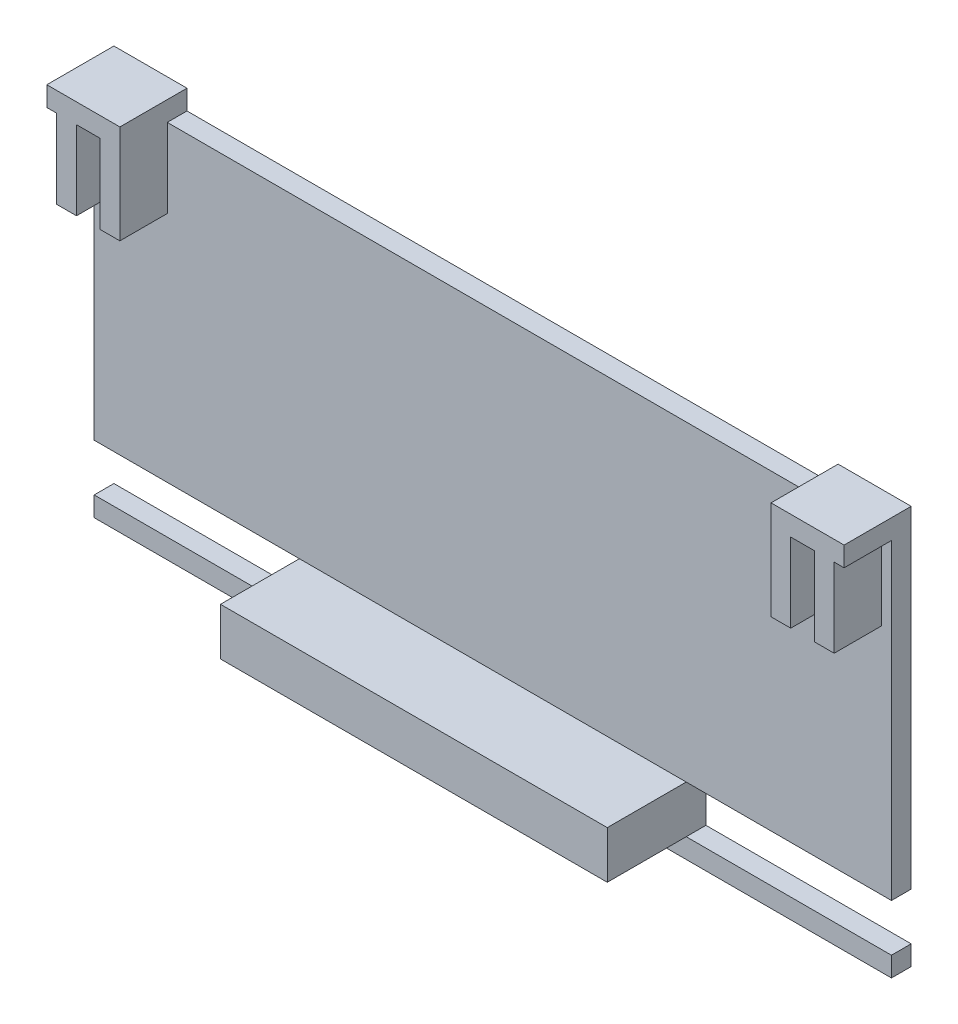
ISO-10303-21;
HEADER;
FILE_DESCRIPTION(('STEP AP214'),'2;1');
FILE_NAME('part.step','',(''),(''),'','','');
FILE_SCHEMA(('AUTOMOTIVE_DESIGN { 1 0 10303 214 1 1 1 1 }'));
ENDSEC;
DATA;
#1=APPLICATION_CONTEXT('core data for automotive mechanical design processes');
#2=APPLICATION_PROTOCOL_DEFINITION('international standard','automotive_design',2000,#1);
#3=PRODUCT_CONTEXT('',#1,'mechanical');
#4=PRODUCT('Part','Part','',(#3));
#5=PRODUCT_RELATED_PRODUCT_CATEGORY('part','',(#4));
#6=PRODUCT_DEFINITION_FORMATION('','',#4);
#7=PRODUCT_DEFINITION_CONTEXT('part definition',#1,'design');
#8=PRODUCT_DEFINITION('design','',#6,#7);
#9=PRODUCT_DEFINITION_SHAPE('','',#8);
#10=(LENGTH_UNIT() NAMED_UNIT(*) SI_UNIT(.MILLI.,.METRE.));
#11=(NAMED_UNIT(*) PLANE_ANGLE_UNIT() SI_UNIT($,.RADIAN.));
#12=(NAMED_UNIT(*) SI_UNIT($,.STERADIAN.) SOLID_ANGLE_UNIT());
#13=UNCERTAINTY_MEASURE_WITH_UNIT(LENGTH_MEASURE(1.E-05),#10,'distance_accuracy_value','');
#14=(GEOMETRIC_REPRESENTATION_CONTEXT(3) GLOBAL_UNCERTAINTY_ASSIGNED_CONTEXT((#13)) GLOBAL_UNIT_ASSIGNED_CONTEXT((#10,
#11,#12)) REPRESENTATION_CONTEXT('',''));
#15=CARTESIAN_POINT('',(0.,0.,0.));
#16=DIRECTION('',(0.,0.,1.));
#17=DIRECTION('',(1.,0.,0.));
#18=AXIS2_PLACEMENT_3D('',#15,#16,#17);
#19=CARTESIAN_POINT('',(0.,0.,1.25));
#20=DIRECTION('',(0.,0.,1.));
#21=DIRECTION('',(1.,0.,0.));
#22=AXIS2_PLACEMENT_3D('',#19,#20,#21);
#23=PLANE('',#22);
#24=DIRECTION('',(-1.,0.,0.));
#25=VECTOR('',#24,1.);
#26=CARTESIAN_POINT('',(49.25,1.25,1.25));
#27=LINE('',#26,#25);
#28=CARTESIAN_POINT('',(49.25,1.25,1.25));
#29=VERTEX_POINT('',#28);
#30=CARTESIAN_POINT('',(36.25,1.25,1.25));
#31=VERTEX_POINT('',#30);
#32=EDGE_CURVE('E362',#29,#31,#27,.T.);
#33=ORIENTED_EDGE('',*,*,#32,.T.);
#34=DIRECTION('',(1.,0.,0.));
#35=VECTOR('',#34,1.);
#36=CARTESIAN_POINT('',(11.75,1.25,1.25));
#37=LINE('',#36,#35);
#38=CARTESIAN_POINT('',(11.75,1.25,1.25));
#39=VERTEX_POINT('',#38);
#40=EDGE_CURVE('E679',#39,#31,#37,.T.);
#41=ORIENTED_EDGE('',*,*,#40,.F.);
#42=DIRECTION('',(-1.,0.,0.));
#43=VECTOR('',#42,1.);
#44=CARTESIAN_POINT('',(-1.25,1.25,1.25));
#45=LINE('',#44,#43);
#46=CARTESIAN_POINT('',(-1.25,1.25,1.25));
#47=VERTEX_POINT('',#46);
#48=EDGE_CURVE('E346',#39,#47,#45,.T.);
#49=ORIENTED_EDGE('',*,*,#48,.T.);
#50=DIRECTION('',(0.,-1.,0.));
#51=VECTOR('',#50,1.);
#52=CARTESIAN_POINT('',(-1.25,0.,1.25));
#53=LINE('',#52,#51);
#54=CARTESIAN_POINT('',(-1.25,0.,1.25));
#55=VERTEX_POINT('',#54);
#56=EDGE_CURVE('E506',#47,#55,#53,.T.);
#57=ORIENTED_EDGE('',*,*,#56,.T.);
#58=DIRECTION('',(1.,0.,0.));
#59=VECTOR('',#58,1.);
#60=CARTESIAN_POINT('',(-1.25,0.,1.25));
#61=LINE('',#60,#59);
#62=CARTESIAN_POINT('',(49.25,0.,1.25));
#63=VERTEX_POINT('',#62);
#64=EDGE_CURVE('E465',#55,#63,#61,.T.);
#65=ORIENTED_EDGE('',*,*,#64,.T.);
#66=DIRECTION('',(0.,1.,0.));
#67=VECTOR('',#66,1.);
#68=CARTESIAN_POINT('',(49.25,0.,1.25));
#69=LINE('',#68,#67);
#70=EDGE_CURVE('E494',#63,#29,#69,.T.);
#71=ORIENTED_EDGE('',*,*,#70,.T.);
#72=EDGE_LOOP('',(#33,#41,#49,#57,#65,#71));
#73=FACE_BOUND('',#72,.T.);
#74=ADVANCED_FACE('F33',(#73),#23,.T.);
#75=DIRECTION('',(1.,0.,0.));
#76=VECTOR('',#75,1.);
#77=CARTESIAN_POINT('',(-1.25,4.25,1.25));
#78=LINE('',#77,#76);
#79=CARTESIAN_POINT('',(-1.25,4.25,1.25));
#80=VERTEX_POINT('',#79);
#81=CARTESIAN_POINT('',(11.75,4.25,1.25));
#82=VERTEX_POINT('',#81);
#83=EDGE_CURVE('E350',#80,#82,#78,.T.);
#84=ORIENTED_EDGE('',*,*,#83,.T.);
#85=DIRECTION('',(-1.,0.,0.));
#86=VECTOR('',#85,1.);
#87=CARTESIAN_POINT('',(11.75,4.25,1.25));
#88=LINE('',#87,#86);
#89=CARTESIAN_POINT('',(36.25,4.25,1.25));
#90=VERTEX_POINT('',#89);
#91=EDGE_CURVE('E274',#90,#82,#88,.T.);
#92=ORIENTED_EDGE('',*,*,#91,.F.);
#93=DIRECTION('',(1.,0.,0.));
#94=VECTOR('',#93,1.);
#95=CARTESIAN_POINT('',(49.25,4.25,1.25));
#96=LINE('',#95,#94);
#97=CARTESIAN_POINT('',(49.25,4.25,1.25));
#98=VERTEX_POINT('',#97);
#99=EDGE_CURVE('E370',#90,#98,#96,.T.);
#100=ORIENTED_EDGE('',*,*,#99,.T.);
#101=CARTESIAN_POINT('',(49.25,24.,1.25));
#102=VERTEX_POINT('',#101);
#103=EDGE_CURVE('E528',#98,#102,#69,.T.);
#104=ORIENTED_EDGE('',*,*,#103,.T.);
#105=DIRECTION('',(-1.,0.,0.));
#106=VECTOR('',#105,1.);
#107=CARTESIAN_POINT('',(-1.25,24.,1.25));
#108=LINE('',#107,#106);
#109=CARTESIAN_POINT('',(48.6214635015819,24.,1.25));
#110=VERTEX_POINT('',#109);
#111=EDGE_CURVE('E504',#102,#110,#108,.T.);
#112=ORIENTED_EDGE('',*,*,#111,.T.);
#113=DIRECTION('',(0.,1.,0.));
#114=VECTOR('',#113,1.);
#115=CARTESIAN_POINT('',(48.6214635015819,19.,1.25));
#116=LINE('',#115,#114);
#117=CARTESIAN_POINT('',(48.6214635015819,19.,1.25));
#118=VERTEX_POINT('',#117);
#119=EDGE_CURVE('E473',#118,#110,#116,.T.);
#120=ORIENTED_EDGE('',*,*,#119,.F.);
#121=DIRECTION('',(-1.,0.,0.));
#122=VECTOR('',#121,1.);
#123=CARTESIAN_POINT('',(47.3714635015819,19.,1.25));
#124=LINE('',#123,#122);
#125=CARTESIAN_POINT('',(47.3714635015819,19.,1.25));
#126=VERTEX_POINT('',#125);
#127=EDGE_CURVE('E459',#118,#126,#124,.T.);
#128=ORIENTED_EDGE('',*,*,#127,.T.);
#129=DIRECTION('',(0.,1.,0.));
#130=VECTOR('',#129,1.);
#131=CARTESIAN_POINT('',(47.3714635015819,19.,1.25));
#132=LINE('',#131,#130);
#133=CARTESIAN_POINT('',(47.3714635015819,24.,1.25));
#134=VERTEX_POINT('',#133);
#135=EDGE_CURVE('E468',#126,#134,#132,.T.);
#136=ORIENTED_EDGE('',*,*,#135,.T.);
#137=CARTESIAN_POINT('',(45.8714635015819,24.,1.25));
#138=VERTEX_POINT('',#137);
#139=EDGE_CURVE('E489',#134,#138,#108,.T.);
#140=ORIENTED_EDGE('',*,*,#139,.T.);
#141=DIRECTION('',(0.,1.,0.));
#142=VECTOR('',#141,1.);
#143=CARTESIAN_POINT('',(45.8714635015819,19.,1.25));
#144=LINE('',#143,#142);
#145=CARTESIAN_POINT('',(45.8714635015819,19.,1.25));
#146=VERTEX_POINT('',#145);
#147=EDGE_CURVE('E443',#146,#138,#144,.T.);
#148=ORIENTED_EDGE('',*,*,#147,.F.);
#149=DIRECTION('',(-1.,0.,0.));
#150=VECTOR('',#149,1.);
#151=CARTESIAN_POINT('',(45.8714635015819,19.,1.25));
#152=LINE('',#151,#150);
#153=CARTESIAN_POINT('',(44.6214635015819,19.,1.25));
#154=VERTEX_POINT('',#153);
#155=EDGE_CURVE('E435',#146,#154,#152,.T.);
#156=ORIENTED_EDGE('',*,*,#155,.T.);
#157=DIRECTION('',(0.,1.,0.));
#158=VECTOR('',#157,1.);
#159=CARTESIAN_POINT('',(44.6214635015819,19.,1.25));
#160=LINE('',#159,#158);
#161=CARTESIAN_POINT('',(44.6214635015819,24.,1.25));
#162=VERTEX_POINT('',#161);
#163=EDGE_CURVE('E447',#154,#162,#160,.T.);
#164=ORIENTED_EDGE('',*,*,#163,.T.);
#165=CARTESIAN_POINT('',(3.37853649841815,24.,1.25));
#166=VERTEX_POINT('',#165);
#167=EDGE_CURVE('E485',#162,#166,#108,.T.);
#168=ORIENTED_EDGE('',*,*,#167,.T.);
#169=DIRECTION('',(0.,1.,0.));
#170=VECTOR('',#169,1.);
#171=CARTESIAN_POINT('',(3.37853649841815,19.,1.25));
#172=LINE('',#171,#170);
#173=CARTESIAN_POINT('',(3.37853649841815,19.,1.25));
#174=VERTEX_POINT('',#173);
#175=EDGE_CURVE('E423',#174,#166,#172,.T.);
#176=ORIENTED_EDGE('',*,*,#175,.F.);
#177=DIRECTION('',(-1.,0.,0.));
#178=VECTOR('',#177,1.);
#179=CARTESIAN_POINT('',(2.12853649841815,19.,1.25));
#180=LINE('',#179,#178);
#181=CARTESIAN_POINT('',(2.12853649841815,19.,1.25));
#182=VERTEX_POINT('',#181);
#183=EDGE_CURVE('E409',#174,#182,#180,.T.);
#184=ORIENTED_EDGE('',*,*,#183,.T.);
#185=DIRECTION('',(0.,1.,0.));
#186=VECTOR('',#185,1.);
#187=CARTESIAN_POINT('',(2.12853649841815,19.,1.25));
#188=LINE('',#187,#186);
#189=CARTESIAN_POINT('',(2.12853649841815,24.,1.25));
#190=VERTEX_POINT('',#189);
#191=EDGE_CURVE('E420',#182,#190,#188,.T.);
#192=ORIENTED_EDGE('',*,*,#191,.T.);
#193=CARTESIAN_POINT('',(0.628536498418146,24.,1.25));
#194=VERTEX_POINT('',#193);
#195=EDGE_CURVE('E490',#190,#194,#108,.T.);
#196=ORIENTED_EDGE('',*,*,#195,.T.);
#197=DIRECTION('',(0.,1.,0.));
#198=VECTOR('',#197,1.);
#199=CARTESIAN_POINT('',(0.628536498418146,19.,1.25));
#200=LINE('',#199,#198);
#201=CARTESIAN_POINT('',(0.628536498418146,19.,1.25));
#202=VERTEX_POINT('',#201);
#203=EDGE_CURVE('E400',#202,#194,#200,.T.);
#204=ORIENTED_EDGE('',*,*,#203,.F.);
#205=DIRECTION('',(-1.,0.,0.));
#206=VECTOR('',#205,1.);
#207=CARTESIAN_POINT('',(0.628536498418146,19.,1.25));
#208=LINE('',#207,#206);
#209=CARTESIAN_POINT('',(-0.621463501581855,19.,1.25));
#210=VERTEX_POINT('',#209);
#211=EDGE_CURVE('E383',#202,#210,#208,.T.);
#212=ORIENTED_EDGE('',*,*,#211,.T.);
#213=DIRECTION('',(0.,1.,0.));
#214=VECTOR('',#213,1.);
#215=CARTESIAN_POINT('',(-0.621463501581855,19.,1.25));
#216=LINE('',#215,#214);
#217=CARTESIAN_POINT('',(-0.621463501581855,24.,1.25));
#218=VERTEX_POINT('',#217);
#219=EDGE_CURVE('E395',#210,#218,#216,.T.);
#220=ORIENTED_EDGE('',*,*,#219,.T.);
#221=CARTESIAN_POINT('',(-1.25,24.,1.25));
#222=VERTEX_POINT('',#221);
#223=EDGE_CURVE('E519',#218,#222,#108,.T.);
#224=ORIENTED_EDGE('',*,*,#223,.T.);
#225=EDGE_CURVE('E496',#222,#80,#53,.T.);
#226=ORIENTED_EDGE('',*,*,#225,.T.);
#227=EDGE_LOOP('',(#84,#92,#100,#104,#112,#120,#128,#136,#140,#148,#156,#164,#168,#176,#184,
#192,#196,#204,#212,#220,#224,#226));
#228=FACE_BOUND('',#227,.T.);
#229=ADVANCED_FACE('F550',(#228),#23,.T.);
#230=CARTESIAN_POINT('',(-1.25,24.,1.25));
#231=DIRECTION('',(0.,-1.,0.));
#232=DIRECTION('',(0.,0.,-1.));
#233=AXIS2_PLACEMENT_3D('',#230,#231,#232);
#234=PLANE('',#233);
#235=DIRECTION('',(0.,0.,-1.));
#236=VECTOR('',#235,1.);
#237=CARTESIAN_POINT('',(3.37853649841815,24.,4.25));
#238=LINE('',#237,#236);
#239=CARTESIAN_POINT('',(3.37853649841815,24.,0.));
#240=VERTEX_POINT('',#239);
#241=EDGE_CURVE('E280',#166,#240,#238,.T.);
#242=ORIENTED_EDGE('',*,*,#241,.F.);
#243=ORIENTED_EDGE('',*,*,#167,.F.);
#244=DIRECTION('',(0.,0.,1.));
#245=VECTOR('',#244,1.);
#246=CARTESIAN_POINT('',(44.6214635015819,24.,4.25));
#247=LINE('',#246,#245);
#248=CARTESIAN_POINT('',(44.6214635015819,24.,0.));
#249=VERTEX_POINT('',#248);
#250=EDGE_CURVE('E55',#249,#162,#247,.T.);
#251=ORIENTED_EDGE('',*,*,#250,.F.);
#252=DIRECTION('',(-1.,0.,0.));
#253=VECTOR('',#252,1.);
#254=CARTESIAN_POINT('',(-1.25,24.,0.));
#255=LINE('',#254,#253);
#256=EDGE_CURVE('E50',#249,#240,#255,.T.);
#257=ORIENTED_EDGE('',*,*,#256,.T.);
#258=EDGE_LOOP('',(#242,#243,#251,#257));
#259=FACE_BOUND('',#258,.T.);
#260=ADVANCED_FACE('F705',(#259),#234,.F.);
#261=CARTESIAN_POINT('',(-1.25,0.,1.25));
#262=DIRECTION('',(1.,0.,0.));
#263=DIRECTION('',(0.,0.,-1.));
#264=AXIS2_PLACEMENT_3D('',#261,#262,#263);
#265=PLANE('',#264);
#266=DIRECTION('',(0.,-1.,0.));
#267=VECTOR('',#266,1.);
#268=CARTESIAN_POINT('',(-1.25,0.,0.));
#269=LINE('',#268,#267);
#270=CARTESIAN_POINT('',(-1.25,25.25,0.));
#271=VERTEX_POINT('',#270);
#272=CARTESIAN_POINT('',(-1.25,4.25,0.));
#273=VERTEX_POINT('',#272);
#274=EDGE_CURVE('E510',#271,#273,#269,.T.);
#275=ORIENTED_EDGE('',*,*,#274,.T.);
#276=DIRECTION('',(0.,0.,-1.));
#277=VECTOR('',#276,1.);
#278=CARTESIAN_POINT('',(-1.25,4.25,14.5916640641263));
#279=LINE('',#278,#277);
#280=EDGE_CURVE('E340',#80,#273,#279,.T.);
#281=ORIENTED_EDGE('',*,*,#280,.F.);
#282=ORIENTED_EDGE('',*,*,#225,.F.);
#283=DIRECTION('',(0.,0.,1.));
#284=VECTOR('',#283,1.);
#285=CARTESIAN_POINT('',(-1.25,24.,4.25));
#286=LINE('',#285,#284);
#287=CARTESIAN_POINT('',(-1.25,24.,4.25));
#288=VERTEX_POINT('',#287);
#289=EDGE_CURVE('E282',#222,#288,#286,.T.);
#290=ORIENTED_EDGE('',*,*,#289,.T.);
#291=DIRECTION('',(0.,-1.,0.));
#292=VECTOR('',#291,1.);
#293=CARTESIAN_POINT('',(-1.25,25.25,4.25));
#294=LINE('',#293,#292);
#295=CARTESIAN_POINT('',(-1.25,25.25,4.25));
#296=VERTEX_POINT('',#295);
#297=EDGE_CURVE('E299',#296,#288,#294,.T.);
#298=ORIENTED_EDGE('',*,*,#297,.F.);
#299=DIRECTION('',(0.,0.,1.));
#300=VECTOR('',#299,1.);
#301=CARTESIAN_POINT('',(-1.25,25.25,4.25));
#302=LINE('',#301,#300);
#303=EDGE_CURVE('E295',#271,#296,#302,.T.);
#304=ORIENTED_EDGE('',*,*,#303,.F.);
#305=EDGE_LOOP('',(#275,#281,#282,#290,#298,#304));
#306=FACE_BOUND('',#305,.T.);
#307=ADVANCED_FACE('F666',(#306),#265,.F.);
#308=CARTESIAN_POINT('',(49.25,0.,1.25));
#309=DIRECTION('',(-1.,0.,0.));
#310=DIRECTION('',(0.,0.,1.));
#311=AXIS2_PLACEMENT_3D('',#308,#309,#310);
#312=PLANE('',#311);
#313=DIRECTION('',(0.,1.,0.));
#314=VECTOR('',#313,1.);
#315=CARTESIAN_POINT('',(49.25,0.,0.));
#316=LINE('',#315,#314);
#317=CARTESIAN_POINT('',(49.25,0.,0.));
#318=VERTEX_POINT('',#317);
#319=CARTESIAN_POINT('',(49.25,1.25,0.));
#320=VERTEX_POINT('',#319);
#321=EDGE_CURVE('E516',#318,#320,#316,.T.);
#322=ORIENTED_EDGE('',*,*,#321,.T.);
#323=DIRECTION('',(0.,0.,-1.));
#324=VECTOR('',#323,1.);
#325=CARTESIAN_POINT('',(49.25,1.25,14.5916640641263));
#326=LINE('',#325,#324);
#327=EDGE_CURVE('E377',#29,#320,#326,.T.);
#328=ORIENTED_EDGE('',*,*,#327,.F.);
#329=ORIENTED_EDGE('',*,*,#70,.F.);
#330=DIRECTION('',(0.,0.,-1.));
#331=VECTOR('',#330,1.);
#332=CARTESIAN_POINT('',(49.25,0.,1.25));
#333=LINE('',#332,#331);
#334=EDGE_CURVE('E11',#63,#318,#333,.T.);
#335=ORIENTED_EDGE('',*,*,#334,.T.);
#336=EDGE_LOOP('',(#322,#328,#329,#335));
#337=FACE_BOUND('',#336,.T.);
#338=ADVANCED_FACE('F592',(#337),#312,.F.);
#339=CARTESIAN_POINT('',(-1.25,0.,1.25));
#340=DIRECTION('',(0.,1.,0.));
#341=DIRECTION('',(-1.,0.,0.));
#342=AXIS2_PLACEMENT_3D('',#339,#340,#341);
#343=PLANE('',#342);
#344=DIRECTION('',(1.,0.,0.));
#345=VECTOR('',#344,1.);
#346=CARTESIAN_POINT('',(-1.25,0.,0.));
#347=LINE('',#346,#345);
#348=CARTESIAN_POINT('',(-1.25,0.,0.));
#349=VERTEX_POINT('',#348);
#350=EDGE_CURVE('E472',#349,#318,#347,.T.);
#351=ORIENTED_EDGE('',*,*,#350,.T.);
#352=ORIENTED_EDGE('',*,*,#334,.F.);
#353=ORIENTED_EDGE('',*,*,#64,.F.);
#354=DIRECTION('',(0.,0.,-1.));
#355=VECTOR('',#354,1.);
#356=CARTESIAN_POINT('',(-1.25,0.,1.25));
#357=LINE('',#356,#355);
#358=EDGE_CURVE('E42',#55,#349,#357,.T.);
#359=ORIENTED_EDGE('',*,*,#358,.T.);
#360=EDGE_LOOP('',(#351,#352,#353,#359));
#361=FACE_BOUND('',#360,.T.);
#362=ADVANCED_FACE('F35',(#361),#343,.F.);
#363=ORIENTED_EDGE('',*,*,#103,.F.);
#364=DIRECTION('',(0.,0.,-1.));
#365=VECTOR('',#364,1.);
#366=CARTESIAN_POINT('',(49.25,4.25,14.5916640641263));
#367=LINE('',#366,#365);
#368=CARTESIAN_POINT('',(49.25,4.25,0.));
#369=VERTEX_POINT('',#368);
#370=EDGE_CURVE('E373',#98,#369,#367,.T.);
#371=ORIENTED_EDGE('',*,*,#370,.T.);
#372=CARTESIAN_POINT('',(49.25,25.25,0.));
#373=VERTEX_POINT('',#372);
#374=EDGE_CURVE('E674',#369,#373,#316,.T.);
#375=ORIENTED_EDGE('',*,*,#374,.T.);
#376=DIRECTION('',(0.,0.,-1.));
#377=VECTOR('',#376,1.);
#378=CARTESIAN_POINT('',(49.25,25.25,4.25));
#379=LINE('',#378,#377);
#380=CARTESIAN_POINT('',(49.25,25.25,4.25));
#381=VERTEX_POINT('',#380);
#382=EDGE_CURVE('E316',#381,#373,#379,.T.);
#383=ORIENTED_EDGE('',*,*,#382,.F.);
#384=DIRECTION('',(0.,-1.,0.));
#385=VECTOR('',#384,1.);
#386=CARTESIAN_POINT('',(49.25,25.25,4.25));
#387=LINE('',#386,#385);
#388=CARTESIAN_POINT('',(49.25,24.,4.25));
#389=VERTEX_POINT('',#388);
#390=EDGE_CURVE('E330',#381,#389,#387,.T.);
#391=ORIENTED_EDGE('',*,*,#390,.T.);
#392=DIRECTION('',(0.,0.,-1.));
#393=VECTOR('',#392,1.);
#394=CARTESIAN_POINT('',(49.25,24.,4.25));
#395=LINE('',#394,#393);
#396=EDGE_CURVE('E314',#389,#102,#395,.T.);
#397=ORIENTED_EDGE('',*,*,#396,.T.);
#398=EDGE_LOOP('',(#363,#371,#375,#383,#391,#397));
#399=FACE_BOUND('',#398,.T.);
#400=ADVANCED_FACE('F616',(#399),#312,.F.);
#401=ORIENTED_EDGE('',*,*,#56,.F.);
#402=DIRECTION('',(0.,0.,-1.));
#403=VECTOR('',#402,1.);
#404=CARTESIAN_POINT('',(-1.25,1.25,14.5916640641263));
#405=LINE('',#404,#403);
#406=CARTESIAN_POINT('',(-1.25,1.25,0.));
#407=VERTEX_POINT('',#406);
#408=EDGE_CURVE('E349',#47,#407,#405,.T.);
#409=ORIENTED_EDGE('',*,*,#408,.T.);
#410=EDGE_CURVE('E513',#407,#349,#269,.T.);
#411=ORIENTED_EDGE('',*,*,#410,.T.);
#412=ORIENTED_EDGE('',*,*,#358,.F.);
#413=EDGE_LOOP('',(#401,#409,#411,#412));
#414=FACE_BOUND('',#413,.T.);
#415=ADVANCED_FACE('F671',(#414),#265,.F.);
#416=CARTESIAN_POINT('',(0.,0.,0.));
#417=DIRECTION('',(0.,0.,1.));
#418=DIRECTION('',(1.,0.,0.));
#419=AXIS2_PLACEMENT_3D('',#416,#417,#418);
#420=PLANE('',#419);
#421=DIRECTION('',(0.,-1.,0.));
#422=VECTOR('',#421,1.);
#423=CARTESIAN_POINT('',(11.75,1.25,0.));
#424=LINE('',#423,#422);
#425=CARTESIAN_POINT('',(11.75,4.25,0.));
#426=VERTEX_POINT('',#425);
#427=CARTESIAN_POINT('',(11.75,1.25,0.));
#428=VERTEX_POINT('',#427);
#429=EDGE_CURVE('E338',#426,#428,#424,.T.);
#430=ORIENTED_EDGE('',*,*,#429,.F.);
#431=DIRECTION('',(1.,0.,0.));
#432=VECTOR('',#431,1.);
#433=CARTESIAN_POINT('',(-1.25,4.25,0.));
#434=LINE('',#433,#432);
#435=EDGE_CURVE('E341',#273,#426,#434,.T.);
#436=ORIENTED_EDGE('',*,*,#435,.F.);
#437=ORIENTED_EDGE('',*,*,#274,.F.);
#438=DIRECTION('',(-1.,0.,0.));
#439=VECTOR('',#438,1.);
#440=CARTESIAN_POINT('',(3.37853649841815,25.25,0.));
#441=LINE('',#440,#439);
#442=CARTESIAN_POINT('',(3.37853649841815,25.25,0.));
#443=VERTEX_POINT('',#442);
#444=EDGE_CURVE('E291',#443,#271,#441,.T.);
#445=ORIENTED_EDGE('',*,*,#444,.F.);
#446=DIRECTION('',(0.,-1.,0.));
#447=VECTOR('',#446,1.);
#448=CARTESIAN_POINT('',(3.37853649841815,25.25,0.));
#449=LINE('',#448,#447);
#450=EDGE_CURVE('E307',#443,#240,#449,.T.);
#451=ORIENTED_EDGE('',*,*,#450,.T.);
#452=ORIENTED_EDGE('',*,*,#256,.F.);
#453=DIRECTION('',(0.,-1.,0.));
#454=VECTOR('',#453,1.);
#455=CARTESIAN_POINT('',(44.6214635015819,25.25,0.));
#456=LINE('',#455,#454);
#457=CARTESIAN_POINT('',(44.6214635015819,25.25,0.));
#458=VERTEX_POINT('',#457);
#459=EDGE_CURVE('E321',#458,#249,#456,.T.);
#460=ORIENTED_EDGE('',*,*,#459,.F.);
#461=DIRECTION('',(-1.,0.,0.));
#462=VECTOR('',#461,1.);
#463=CARTESIAN_POINT('',(44.6214635015819,25.25,0.));
#464=LINE('',#463,#462);
#465=EDGE_CURVE('E319',#373,#458,#464,.T.);
#466=ORIENTED_EDGE('',*,*,#465,.F.);
#467=ORIENTED_EDGE('',*,*,#374,.F.);
#468=DIRECTION('',(1.,0.,0.));
#469=VECTOR('',#468,1.);
#470=CARTESIAN_POINT('',(49.25,4.25,0.));
#471=LINE('',#470,#469);
#472=CARTESIAN_POINT('',(36.25,4.25,0.));
#473=VERTEX_POINT('',#472);
#474=EDGE_CURVE('E360',#473,#369,#471,.T.);
#475=ORIENTED_EDGE('',*,*,#474,.F.);
#476=DIRECTION('',(0.,1.,0.));
#477=VECTOR('',#476,1.);
#478=CARTESIAN_POINT('',(36.25,1.25,0.));
#479=LINE('',#478,#477);
#480=CARTESIAN_POINT('',(36.25,1.25,0.));
#481=VERTEX_POINT('',#480);
#482=EDGE_CURVE('E363',#481,#473,#479,.T.);
#483=ORIENTED_EDGE('',*,*,#482,.F.);
#484=DIRECTION('',(-1.,0.,0.));
#485=VECTOR('',#484,1.);
#486=CARTESIAN_POINT('',(49.25,1.25,0.));
#487=LINE('',#486,#485);
#488=EDGE_CURVE('E359',#320,#481,#487,.T.);
#489=ORIENTED_EDGE('',*,*,#488,.F.);
#490=ORIENTED_EDGE('',*,*,#321,.F.);
#491=ORIENTED_EDGE('',*,*,#350,.F.);
#492=ORIENTED_EDGE('',*,*,#410,.F.);
#493=DIRECTION('',(-1.,0.,0.));
#494=VECTOR('',#493,1.);
#495=CARTESIAN_POINT('',(-1.25,1.25,0.));
#496=LINE('',#495,#494);
#497=EDGE_CURVE('E344',#428,#407,#496,.T.);
#498=ORIENTED_EDGE('',*,*,#497,.F.);
#499=EDGE_LOOP('',(#430,#436,#437,#445,#451,#452,#460,#466,#467,#475,#483,#489,#490,#491,#492,#498));
#500=FACE_BOUND('',#499,.T.);
#501=ADVANCED_FACE('F600',(#500),#420,.F.);
#502=CARTESIAN_POINT('',(47.3714635015819,19.,1.25));
#503=DIRECTION('',(-1.,0.,0.));
#504=DIRECTION('',(0.,-1.,0.));
#505=AXIS2_PLACEMENT_3D('',#502,#503,#504);
#506=PLANE('',#505);
#507=DIRECTION('',(0.,0.,1.));
#508=VECTOR('',#507,1.);
#509=CARTESIAN_POINT('',(47.3714635015819,24.,1.25));
#510=LINE('',#509,#508);
#511=CARTESIAN_POINT('',(47.3714635015819,24.,4.25));
#512=VERTEX_POINT('',#511);
#513=EDGE_CURVE('E482',#134,#512,#510,.T.);
#514=ORIENTED_EDGE('',*,*,#513,.F.);
#515=ORIENTED_EDGE('',*,*,#135,.F.);
#516=DIRECTION('',(0.,0.,1.));
#517=VECTOR('',#516,1.);
#518=CARTESIAN_POINT('',(47.3714635015819,19.,1.25));
#519=LINE('',#518,#517);
#520=CARTESIAN_POINT('',(47.3714635015819,19.,4.25));
#521=VERTEX_POINT('',#520);
#522=EDGE_CURVE('E450',#126,#521,#519,.T.);
#523=ORIENTED_EDGE('',*,*,#522,.T.);
#524=DIRECTION('',(0.,1.,0.));
#525=VECTOR('',#524,1.);
#526=CARTESIAN_POINT('',(47.3714635015819,19.,4.25));
#527=LINE('',#526,#525);
#528=EDGE_CURVE('E462',#521,#512,#527,.T.);
#529=ORIENTED_EDGE('',*,*,#528,.T.);
#530=EDGE_LOOP('',(#514,#515,#523,#529));
#531=FACE_BOUND('',#530,.T.);
#532=ADVANCED_FACE('F635',(#531),#506,.T.);
#533=CARTESIAN_POINT('',(48.6214635015819,19.,1.25));
#534=DIRECTION('',(1.,0.,0.));
#535=DIRECTION('',(0.,1.,0.));
#536=AXIS2_PLACEMENT_3D('',#533,#534,#535);
#537=PLANE('',#536);
#538=DIRECTION('',(0.,0.,-1.));
#539=VECTOR('',#538,1.);
#540=CARTESIAN_POINT('',(48.6214635015819,24.,1.25));
#541=LINE('',#540,#539);
#542=CARTESIAN_POINT('',(48.6214635015819,24.,4.25));
#543=VERTEX_POINT('',#542);
#544=EDGE_CURVE('E454',#543,#110,#541,.T.);
#545=ORIENTED_EDGE('',*,*,#544,.F.);
#546=DIRECTION('',(0.,1.,0.));
#547=VECTOR('',#546,1.);
#548=CARTESIAN_POINT('',(48.6214635015819,19.,4.25));
#549=LINE('',#548,#547);
#550=CARTESIAN_POINT('',(48.6214635015819,19.,4.25));
#551=VERTEX_POINT('',#550);
#552=EDGE_CURVE('E477',#551,#543,#549,.T.);
#553=ORIENTED_EDGE('',*,*,#552,.F.);
#554=DIRECTION('',(0.,0.,-1.));
#555=VECTOR('',#554,1.);
#556=CARTESIAN_POINT('',(48.6214635015819,19.,1.25));
#557=LINE('',#556,#555);
#558=EDGE_CURVE('E457',#551,#118,#557,.T.);
#559=ORIENTED_EDGE('',*,*,#558,.T.);
#560=ORIENTED_EDGE('',*,*,#119,.T.);
#561=EDGE_LOOP('',(#545,#553,#559,#560));
#562=FACE_BOUND('',#561,.T.);
#563=ADVANCED_FACE('F628',(#562),#537,.T.);
#564=CARTESIAN_POINT('',(47.3714635015819,19.,4.25));
#565=DIRECTION('',(0.,0.,1.));
#566=DIRECTION('',(1.,0.,0.));
#567=AXIS2_PLACEMENT_3D('',#564,#565,#566);
#568=PLANE('',#567);
#569=ORIENTED_EDGE('',*,*,#552,.T.);
#570=DIRECTION('',(1.,0.,0.));
#571=VECTOR('',#570,1.);
#572=CARTESIAN_POINT('',(44.6214635015819,24.,4.25));
#573=LINE('',#572,#571);
#574=EDGE_CURVE('E329',#543,#389,#573,.T.);
#575=ORIENTED_EDGE('',*,*,#574,.T.);
#576=ORIENTED_EDGE('',*,*,#390,.F.);
#577=DIRECTION('',(1.,0.,0.));
#578=VECTOR('',#577,1.);
#579=CARTESIAN_POINT('',(44.6214635015819,25.25,4.25));
#580=LINE('',#579,#578);
#581=CARTESIAN_POINT('',(44.6214635015819,25.25,4.25));
#582=VERTEX_POINT('',#581);
#583=EDGE_CURVE('E313',#582,#381,#580,.T.);
#584=ORIENTED_EDGE('',*,*,#583,.F.);
#585=DIRECTION('',(0.,1.,0.));
#586=VECTOR('',#585,1.);
#587=CARTESIAN_POINT('',(44.6214635015819,19.,4.25));
#588=LINE('',#587,#586);
#589=CARTESIAN_POINT('',(44.6214635015819,19.,4.25));
#590=VERTEX_POINT('',#589);
#591=EDGE_CURVE('E444',#590,#582,#588,.T.);
#592=ORIENTED_EDGE('',*,*,#591,.F.);
#593=DIRECTION('',(1.,0.,0.));
#594=VECTOR('',#593,1.);
#595=CARTESIAN_POINT('',(45.8714635015819,19.,4.25));
#596=LINE('',#595,#594);
#597=CARTESIAN_POINT('',(45.8714635015819,19.,4.25));
#598=VERTEX_POINT('',#597);
#599=EDGE_CURVE('E440',#590,#598,#596,.T.);
#600=ORIENTED_EDGE('',*,*,#599,.T.);
#601=DIRECTION('',(0.,1.,0.));
#602=VECTOR('',#601,1.);
#603=CARTESIAN_POINT('',(45.8714635015819,19.,4.25));
#604=LINE('',#603,#602);
#605=CARTESIAN_POINT('',(45.8714635015819,24.,4.25));
#606=VERTEX_POINT('',#605);
#607=EDGE_CURVE('E446',#598,#606,#604,.T.);
#608=ORIENTED_EDGE('',*,*,#607,.T.);
#609=EDGE_CURVE('E333',#606,#512,#573,.T.);
#610=ORIENTED_EDGE('',*,*,#609,.T.);
#611=ORIENTED_EDGE('',*,*,#528,.F.);
#612=DIRECTION('',(1.,0.,0.));
#613=VECTOR('',#612,1.);
#614=CARTESIAN_POINT('',(47.3714635015819,19.,4.25));
#615=LINE('',#614,#613);
#616=EDGE_CURVE('E453',#521,#551,#615,.T.);
#617=ORIENTED_EDGE('',*,*,#616,.T.);
#618=EDGE_LOOP('',(#569,#575,#576,#584,#592,#600,#608,#610,#611,#617));
#619=FACE_BOUND('',#618,.T.);
#620=ADVANCED_FACE('F637',(#619),#568,.T.);
#621=CARTESIAN_POINT('',(0.,19.,0.));
#622=DIRECTION('',(0.,1.,0.));
#623=DIRECTION('',(0.,0.,1.));
#624=AXIS2_PLACEMENT_3D('',#621,#622,#623);
#625=PLANE('',#624);
#626=ORIENTED_EDGE('',*,*,#522,.F.);
#627=ORIENTED_EDGE('',*,*,#127,.F.);
#628=ORIENTED_EDGE('',*,*,#558,.F.);
#629=ORIENTED_EDGE('',*,*,#616,.F.);
#630=EDGE_LOOP('',(#626,#627,#628,#629));
#631=FACE_BOUND('',#630,.T.);
#632=ADVANCED_FACE('F633',(#631),#625,.F.);
#633=CARTESIAN_POINT('',(45.8714635015819,19.,1.25));
#634=DIRECTION('',(1.,0.,0.));
#635=DIRECTION('',(0.,1.,0.));
#636=AXIS2_PLACEMENT_3D('',#633,#634,#635);
#637=PLANE('',#636);
#638=DIRECTION('',(0.,0.,-1.));
#639=VECTOR('',#638,1.);
#640=CARTESIAN_POINT('',(45.8714635015819,24.,1.25));
#641=LINE('',#640,#639);
#642=EDGE_CURVE('E426',#606,#138,#641,.T.);
#643=ORIENTED_EDGE('',*,*,#642,.F.);
#644=ORIENTED_EDGE('',*,*,#607,.F.);
#645=DIRECTION('',(0.,0.,-1.));
#646=VECTOR('',#645,1.);
#647=CARTESIAN_POINT('',(45.8714635015819,19.,1.25));
#648=LINE('',#647,#646);
#649=EDGE_CURVE('E432',#598,#146,#648,.T.);
#650=ORIENTED_EDGE('',*,*,#649,.T.);
#651=ORIENTED_EDGE('',*,*,#147,.T.);
#652=EDGE_LOOP('',(#643,#644,#650,#651));
#653=FACE_BOUND('',#652,.T.);
#654=ADVANCED_FACE('F546',(#653),#637,.T.);
#655=CARTESIAN_POINT('',(44.6214635015819,19.,1.25));
#656=DIRECTION('',(-1.,0.,0.));
#657=DIRECTION('',(0.,-1.,0.));
#658=AXIS2_PLACEMENT_3D('',#655,#656,#657);
#659=PLANE('',#658);
#660=ORIENTED_EDGE('',*,*,#591,.T.);
#661=DIRECTION('',(0.,0.,1.));
#662=VECTOR('',#661,1.);
#663=CARTESIAN_POINT('',(44.6214635015819,25.25,4.25));
#664=LINE('',#663,#662);
#665=EDGE_CURVE('E310',#458,#582,#664,.T.);
#666=ORIENTED_EDGE('',*,*,#665,.F.);
#667=ORIENTED_EDGE('',*,*,#459,.T.);
#668=ORIENTED_EDGE('',*,*,#250,.T.);
#669=ORIENTED_EDGE('',*,*,#163,.F.);
#670=DIRECTION('',(0.,0.,1.));
#671=VECTOR('',#670,1.);
#672=CARTESIAN_POINT('',(44.6214635015819,19.,1.25));
#673=LINE('',#672,#671);
#674=EDGE_CURVE('E437',#154,#590,#673,.T.);
#675=ORIENTED_EDGE('',*,*,#674,.T.);
#676=EDGE_LOOP('',(#660,#666,#667,#668,#669,#675));
#677=FACE_BOUND('',#676,.T.);
#678=ADVANCED_FACE('F557',(#677),#659,.T.);
#679=CARTESIAN_POINT('',(0.,19.,0.));
#680=DIRECTION('',(0.,-1.,0.));
#681=DIRECTION('',(0.,0.,-1.));
#682=AXIS2_PLACEMENT_3D('',#679,#680,#681);
#683=PLANE('',#682);
#684=ORIENTED_EDGE('',*,*,#649,.F.);
#685=ORIENTED_EDGE('',*,*,#599,.F.);
#686=ORIENTED_EDGE('',*,*,#674,.F.);
#687=ORIENTED_EDGE('',*,*,#155,.F.);
#688=EDGE_LOOP('',(#684,#685,#686,#687));
#689=FACE_BOUND('',#688,.T.);
#690=ADVANCED_FACE('F554',(#689),#683,.T.);
#691=CARTESIAN_POINT('',(3.37853649841815,19.,1.25));
#692=DIRECTION('',(1.,0.,0.));
#693=DIRECTION('',(0.,1.,0.));
#694=AXIS2_PLACEMENT_3D('',#691,#692,#693);
#695=PLANE('',#694);
#696=ORIENTED_EDGE('',*,*,#175,.T.);
#697=ORIENTED_EDGE('',*,*,#241,.T.);
#698=ORIENTED_EDGE('',*,*,#450,.F.);
#699=DIRECTION('',(0.,0.,-1.));
#700=VECTOR('',#699,1.);
#701=CARTESIAN_POINT('',(3.37853649841815,25.25,4.25));
#702=LINE('',#701,#700);
#703=CARTESIAN_POINT('',(3.37853649841815,25.25,4.25));
#704=VERTEX_POINT('',#703);
#705=EDGE_CURVE('E288',#704,#443,#702,.T.);
#706=ORIENTED_EDGE('',*,*,#705,.F.);
#707=DIRECTION('',(0.,1.,0.));
#708=VECTOR('',#707,1.);
#709=CARTESIAN_POINT('',(3.37853649841815,19.,4.25));
#710=LINE('',#709,#708);
#711=CARTESIAN_POINT('',(3.37853649841815,19.,4.25));
#712=VERTEX_POINT('',#711);
#713=EDGE_CURVE('E427',#712,#704,#710,.T.);
#714=ORIENTED_EDGE('',*,*,#713,.F.);
#715=DIRECTION('',(0.,0.,-1.));
#716=VECTOR('',#715,1.);
#717=CARTESIAN_POINT('',(3.37853649841815,19.,1.25));
#718=LINE('',#717,#716);
#719=EDGE_CURVE('E417',#712,#174,#718,.T.);
#720=ORIENTED_EDGE('',*,*,#719,.T.);
#721=EDGE_LOOP('',(#696,#697,#698,#706,#714,#720));
#722=FACE_BOUND('',#721,.T.);
#723=ADVANCED_FACE('F562',(#722),#695,.T.);
#724=CARTESIAN_POINT('',(2.12853649841815,19.,4.25));
#725=DIRECTION('',(0.,0.,1.));
#726=DIRECTION('',(1.,0.,0.));
#727=AXIS2_PLACEMENT_3D('',#724,#725,#726);
#728=PLANE('',#727);
#729=ORIENTED_EDGE('',*,*,#713,.T.);
#730=DIRECTION('',(1.,0.,0.));
#731=VECTOR('',#730,1.);
#732=CARTESIAN_POINT('',(3.37853649841815,25.25,4.25));
#733=LINE('',#732,#731);
#734=EDGE_CURVE('E297',#296,#704,#733,.T.);
#735=ORIENTED_EDGE('',*,*,#734,.F.);
#736=ORIENTED_EDGE('',*,*,#297,.T.);
#737=DIRECTION('',(1.,0.,0.));
#738=VECTOR('',#737,1.);
#739=CARTESIAN_POINT('',(3.37853649841815,24.,4.25));
#740=LINE('',#739,#738);
#741=CARTESIAN_POINT('',(-0.621463501581855,24.,4.25));
#742=VERTEX_POINT('',#741);
#743=EDGE_CURVE('E292',#288,#742,#740,.T.);
#744=ORIENTED_EDGE('',*,*,#743,.T.);
#745=DIRECTION('',(0.,1.,0.));
#746=VECTOR('',#745,1.);
#747=CARTESIAN_POINT('',(-0.621463501581855,19.,4.25));
#748=LINE('',#747,#746);
#749=CARTESIAN_POINT('',(-0.621463501581855,19.,4.25));
#750=VERTEX_POINT('',#749);
#751=EDGE_CURVE('E406',#750,#742,#748,.T.);
#752=ORIENTED_EDGE('',*,*,#751,.F.);
#753=DIRECTION('',(1.,0.,0.));
#754=VECTOR('',#753,1.);
#755=CARTESIAN_POINT('',(0.628536498418146,19.,4.25));
#756=LINE('',#755,#754);
#757=CARTESIAN_POINT('',(0.628536498418146,19.,4.25));
#758=VERTEX_POINT('',#757);
#759=EDGE_CURVE('E389',#750,#758,#756,.T.);
#760=ORIENTED_EDGE('',*,*,#759,.T.);
#761=DIRECTION('',(0.,1.,0.));
#762=VECTOR('',#761,1.);
#763=CARTESIAN_POINT('',(0.628536498418146,19.,4.25));
#764=LINE('',#763,#762);
#765=CARTESIAN_POINT('',(0.628536498418146,24.,4.25));
#766=VERTEX_POINT('',#765);
#767=EDGE_CURVE('E404',#758,#766,#764,.T.);
#768=ORIENTED_EDGE('',*,*,#767,.T.);
#769=CARTESIAN_POINT('',(2.12853649841815,24.,4.25));
#770=VERTEX_POINT('',#769);
#771=EDGE_CURVE('E302',#766,#770,#740,.T.);
#772=ORIENTED_EDGE('',*,*,#771,.T.);
#773=DIRECTION('',(0.,1.,0.));
#774=VECTOR('',#773,1.);
#775=CARTESIAN_POINT('',(2.12853649841815,19.,4.25));
#776=LINE('',#775,#774);
#777=CARTESIAN_POINT('',(2.12853649841815,19.,4.25));
#778=VERTEX_POINT('',#777);
#779=EDGE_CURVE('E429',#778,#770,#776,.T.);
#780=ORIENTED_EDGE('',*,*,#779,.F.);
#781=DIRECTION('',(1.,0.,0.));
#782=VECTOR('',#781,1.);
#783=CARTESIAN_POINT('',(2.12853649841815,19.,4.25));
#784=LINE('',#783,#782);
#785=EDGE_CURVE('E414',#778,#712,#784,.T.);
#786=ORIENTED_EDGE('',*,*,#785,.T.);
#787=EDGE_LOOP('',(#729,#735,#736,#744,#752,#760,#768,#772,#780,#786));
#788=FACE_BOUND('',#787,.T.);
#789=ADVANCED_FACE('F648',(#788),#728,.T.);
#790=CARTESIAN_POINT('',(2.12853649841815,19.,1.25));
#791=DIRECTION('',(-1.,0.,0.));
#792=DIRECTION('',(0.,-1.,0.));
#793=AXIS2_PLACEMENT_3D('',#790,#791,#792);
#794=PLANE('',#793);
#795=DIRECTION('',(0.,0.,1.));
#796=VECTOR('',#795,1.);
#797=CARTESIAN_POINT('',(2.12853649841815,24.,1.25));
#798=LINE('',#797,#796);
#799=EDGE_CURVE('E403',#190,#770,#798,.T.);
#800=ORIENTED_EDGE('',*,*,#799,.F.);
#801=ORIENTED_EDGE('',*,*,#191,.F.);
#802=DIRECTION('',(0.,0.,1.));
#803=VECTOR('',#802,1.);
#804=CARTESIAN_POINT('',(2.12853649841815,19.,1.25));
#805=LINE('',#804,#803);
#806=EDGE_CURVE('E411',#182,#778,#805,.T.);
#807=ORIENTED_EDGE('',*,*,#806,.T.);
#808=ORIENTED_EDGE('',*,*,#779,.T.);
#809=EDGE_LOOP('',(#800,#801,#807,#808));
#810=FACE_BOUND('',#809,.T.);
#811=ADVANCED_FACE('F573',(#810),#794,.T.);
#812=CARTESIAN_POINT('',(0.,19.,0.));
#813=DIRECTION('',(0.,-1.,0.));
#814=DIRECTION('',(0.,0.,-1.));
#815=AXIS2_PLACEMENT_3D('',#812,#813,#814);
#816=PLANE('',#815);
#817=ORIENTED_EDGE('',*,*,#183,.F.);
#818=ORIENTED_EDGE('',*,*,#719,.F.);
#819=ORIENTED_EDGE('',*,*,#785,.F.);
#820=ORIENTED_EDGE('',*,*,#806,.F.);
#821=EDGE_LOOP('',(#817,#818,#819,#820));
#822=FACE_BOUND('',#821,.T.);
#823=ADVANCED_FACE('F568',(#822),#816,.T.);
#824=CARTESIAN_POINT('',(0.628536498418146,19.,1.25));
#825=DIRECTION('',(1.,0.,0.));
#826=DIRECTION('',(0.,1.,0.));
#827=AXIS2_PLACEMENT_3D('',#824,#825,#826);
#828=PLANE('',#827);
#829=DIRECTION('',(0.,0.,-1.));
#830=VECTOR('',#829,1.);
#831=CARTESIAN_POINT('',(0.628536498418146,24.,1.25));
#832=LINE('',#831,#830);
#833=EDGE_CURVE('E386',#766,#194,#832,.T.);
#834=ORIENTED_EDGE('',*,*,#833,.F.);
#835=ORIENTED_EDGE('',*,*,#767,.F.);
#836=DIRECTION('',(0.,0.,-1.));
#837=VECTOR('',#836,1.);
#838=CARTESIAN_POINT('',(0.628536498418146,19.,1.25));
#839=LINE('',#838,#837);
#840=EDGE_CURVE('E392',#758,#202,#839,.T.);
#841=ORIENTED_EDGE('',*,*,#840,.T.);
#842=ORIENTED_EDGE('',*,*,#203,.T.);
#843=EDGE_LOOP('',(#834,#835,#841,#842));
#844=FACE_BOUND('',#843,.T.);
#845=ADVANCED_FACE('F653',(#844),#828,.T.);
#846=CARTESIAN_POINT('',(-0.621463501581855,19.,1.25));
#847=DIRECTION('',(-1.,0.,0.));
#848=DIRECTION('',(0.,-1.,0.));
#849=AXIS2_PLACEMENT_3D('',#846,#847,#848);
#850=PLANE('',#849);
#851=DIRECTION('',(0.,0.,1.));
#852=VECTOR('',#851,1.);
#853=CARTESIAN_POINT('',(-0.621463501581855,24.,1.25));
#854=LINE('',#853,#852);
#855=EDGE_CURVE('E382',#218,#742,#854,.T.);
#856=ORIENTED_EDGE('',*,*,#855,.F.);
#857=ORIENTED_EDGE('',*,*,#219,.F.);
#858=DIRECTION('',(0.,0.,1.));
#859=VECTOR('',#858,1.);
#860=CARTESIAN_POINT('',(-0.621463501581855,19.,1.25));
#861=LINE('',#860,#859);
#862=EDGE_CURVE('E385',#210,#750,#861,.T.);
#863=ORIENTED_EDGE('',*,*,#862,.T.);
#864=ORIENTED_EDGE('',*,*,#751,.T.);
#865=EDGE_LOOP('',(#856,#857,#863,#864));
#866=FACE_BOUND('',#865,.T.);
#867=ADVANCED_FACE('F661',(#866),#850,.T.);
#868=CARTESIAN_POINT('',(0.,19.,0.));
#869=DIRECTION('',(0.,1.,0.));
#870=DIRECTION('',(0.,0.,1.));
#871=AXIS2_PLACEMENT_3D('',#868,#869,#870);
#872=PLANE('',#871);
#873=ORIENTED_EDGE('',*,*,#211,.F.);
#874=ORIENTED_EDGE('',*,*,#840,.F.);
#875=ORIENTED_EDGE('',*,*,#759,.F.);
#876=ORIENTED_EDGE('',*,*,#862,.F.);
#877=EDGE_LOOP('',(#873,#874,#875,#876));
#878=FACE_BOUND('',#877,.T.);
#879=ADVANCED_FACE('F658',(#878),#872,.F.);
#880=CARTESIAN_POINT('',(49.25,1.25,14.5916640641263));
#881=DIRECTION('',(0.,-1.,0.));
#882=DIRECTION('',(0.,0.,-1.));
#883=AXIS2_PLACEMENT_3D('',#880,#881,#882);
#884=PLANE('',#883);
#885=ORIENTED_EDGE('',*,*,#327,.T.);
#886=ORIENTED_EDGE('',*,*,#488,.T.);
#887=DIRECTION('',(0.,0.,-1.));
#888=VECTOR('',#887,1.);
#889=CARTESIAN_POINT('',(36.25,1.25,14.5916640641263));
#890=LINE('',#889,#888);
#891=EDGE_CURVE('E369',#31,#481,#890,.T.);
#892=ORIENTED_EDGE('',*,*,#891,.F.);
#893=ORIENTED_EDGE('',*,*,#32,.F.);
#894=EDGE_LOOP('',(#885,#886,#892,#893));
#895=FACE_BOUND('',#894,.T.);
#896=ADVANCED_FACE('F596',(#895),#884,.F.);
#897=CARTESIAN_POINT('',(36.25,1.25,14.5916640641263));
#898=DIRECTION('',(-1.,0.,0.));
#899=DIRECTION('',(0.,0.,1.));
#900=AXIS2_PLACEMENT_3D('',#897,#898,#899);
#901=PLANE('',#900);
#902=ORIENTED_EDGE('',*,*,#891,.T.);
#903=ORIENTED_EDGE('',*,*,#482,.T.);
#904=DIRECTION('',(0.,0.,-1.));
#905=VECTOR('',#904,1.);
#906=CARTESIAN_POINT('',(36.25,4.25,14.5916640641263));
#907=LINE('',#906,#905);
#908=EDGE_CURVE('E374',#90,#473,#907,.T.);
#909=ORIENTED_EDGE('',*,*,#908,.F.);
#910=DIRECTION('',(0.,0.,-1.));
#911=VECTOR('',#910,1.);
#912=CARTESIAN_POINT('',(36.25,4.25,6.25));
#913=LINE('',#912,#911);
#914=CARTESIAN_POINT('',(36.25,4.25,6.25));
#915=VERTEX_POINT('',#914);
#916=EDGE_CURVE('E284',#915,#90,#913,.T.);
#917=ORIENTED_EDGE('',*,*,#916,.F.);
#918=DIRECTION('',(0.,1.,0.));
#919=VECTOR('',#918,1.);
#920=CARTESIAN_POINT('',(36.25,1.25,6.25));
#921=LINE('',#920,#919);
#922=CARTESIAN_POINT('',(36.25,1.25,6.25));
#923=VERTEX_POINT('',#922);
#924=EDGE_CURVE('E264',#923,#915,#921,.T.);
#925=ORIENTED_EDGE('',*,*,#924,.F.);
#926=DIRECTION('',(0.,0.,-1.));
#927=VECTOR('',#926,1.);
#928=CARTESIAN_POINT('',(36.25,1.25,6.25));
#929=LINE('',#928,#927);
#930=EDGE_CURVE('E261',#923,#31,#929,.T.);
#931=ORIENTED_EDGE('',*,*,#930,.T.);
#932=EDGE_LOOP('',(#902,#903,#909,#917,#925,#931));
#933=FACE_BOUND('',#932,.T.);
#934=ADVANCED_FACE('F606',(#933),#901,.F.);
#935=CARTESIAN_POINT('',(49.25,4.25,14.5916640641263));
#936=DIRECTION('',(0.,1.,0.));
#937=DIRECTION('',(0.,0.,1.));
#938=AXIS2_PLACEMENT_3D('',#935,#936,#937);
#939=PLANE('',#938);
#940=ORIENTED_EDGE('',*,*,#908,.T.);
#941=ORIENTED_EDGE('',*,*,#474,.T.);
#942=ORIENTED_EDGE('',*,*,#370,.F.);
#943=ORIENTED_EDGE('',*,*,#99,.F.);
#944=EDGE_LOOP('',(#940,#941,#942,#943));
#945=FACE_BOUND('',#944,.T.);
#946=ADVANCED_FACE('F611',(#945),#939,.F.);
#947=CARTESIAN_POINT('',(-1.25,4.25,14.5916640641263));
#948=DIRECTION('',(0.,1.,0.));
#949=DIRECTION('',(0.,0.,1.));
#950=AXIS2_PLACEMENT_3D('',#947,#948,#949);
#951=PLANE('',#950);
#952=ORIENTED_EDGE('',*,*,#280,.T.);
#953=ORIENTED_EDGE('',*,*,#435,.T.);
#954=DIRECTION('',(0.,0.,-1.));
#955=VECTOR('',#954,1.);
#956=CARTESIAN_POINT('',(11.75,4.25,14.5916640641263));
#957=LINE('',#956,#955);
#958=EDGE_CURVE('E353',#82,#426,#957,.T.);
#959=ORIENTED_EDGE('',*,*,#958,.F.);
#960=ORIENTED_EDGE('',*,*,#83,.F.);
#961=EDGE_LOOP('',(#952,#953,#959,#960));
#962=FACE_BOUND('',#961,.T.);
#963=ADVANCED_FACE('F689',(#962),#951,.F.);
#964=CARTESIAN_POINT('',(11.75,1.25,14.5916640641263));
#965=DIRECTION('',(1.,0.,0.));
#966=DIRECTION('',(0.,0.,-1.));
#967=AXIS2_PLACEMENT_3D('',#964,#965,#966);
#968=PLANE('',#967);
#969=ORIENTED_EDGE('',*,*,#958,.T.);
#970=ORIENTED_EDGE('',*,*,#429,.T.);
#971=DIRECTION('',(0.,0.,-1.));
#972=VECTOR('',#971,1.);
#973=CARTESIAN_POINT('',(11.75,1.25,14.5916640641263));
#974=LINE('',#973,#972);
#975=EDGE_CURVE('E278',#39,#428,#974,.T.);
#976=ORIENTED_EDGE('',*,*,#975,.F.);
#977=DIRECTION('',(0.,0.,-1.));
#978=VECTOR('',#977,1.);
#979=CARTESIAN_POINT('',(11.75,1.25,6.25));
#980=LINE('',#979,#978);
#981=CARTESIAN_POINT('',(11.75,1.25,6.25));
#982=VERTEX_POINT('',#981);
#983=EDGE_CURVE('E259',#982,#39,#980,.T.);
#984=ORIENTED_EDGE('',*,*,#983,.F.);
#985=DIRECTION('',(0.,-1.,0.));
#986=VECTOR('',#985,1.);
#987=CARTESIAN_POINT('',(11.75,1.25,6.25));
#988=LINE('',#987,#986);
#989=CARTESIAN_POINT('',(11.75,4.25,6.25));
#990=VERTEX_POINT('',#989);
#991=EDGE_CURVE('E265',#990,#982,#988,.T.);
#992=ORIENTED_EDGE('',*,*,#991,.F.);
#993=DIRECTION('',(0.,0.,-1.));
#994=VECTOR('',#993,1.);
#995=CARTESIAN_POINT('',(11.75,4.25,6.25));
#996=LINE('',#995,#994);
#997=EDGE_CURVE('E685',#990,#82,#996,.T.);
#998=ORIENTED_EDGE('',*,*,#997,.T.);
#999=EDGE_LOOP('',(#969,#970,#976,#984,#992,#998));
#1000=FACE_BOUND('',#999,.T.);
#1001=ADVANCED_FACE('F276',(#1000),#968,.F.);
#1002=CARTESIAN_POINT('',(-1.25,1.25,14.5916640641263));
#1003=DIRECTION('',(0.,-1.,0.));
#1004=DIRECTION('',(0.,0.,-1.));
#1005=AXIS2_PLACEMENT_3D('',#1002,#1003,#1004);
#1006=PLANE('',#1005);
#1007=ORIENTED_EDGE('',*,*,#975,.T.);
#1008=ORIENTED_EDGE('',*,*,#497,.T.);
#1009=ORIENTED_EDGE('',*,*,#408,.F.);
#1010=ORIENTED_EDGE('',*,*,#48,.F.);
#1011=EDGE_LOOP('',(#1007,#1008,#1009,#1010));
#1012=FACE_BOUND('',#1011,.T.);
#1013=ADVANCED_FACE('F678',(#1012),#1006,.F.);
#1014=CARTESIAN_POINT('',(0.,24.,0.));
#1015=DIRECTION('',(0.,-1.,0.));
#1016=DIRECTION('',(0.,0.,-1.));
#1017=AXIS2_PLACEMENT_3D('',#1014,#1015,#1016);
#1018=PLANE('',#1017);
#1019=ORIENTED_EDGE('',*,*,#609,.F.);
#1020=ORIENTED_EDGE('',*,*,#642,.T.);
#1021=ORIENTED_EDGE('',*,*,#139,.F.);
#1022=ORIENTED_EDGE('',*,*,#513,.T.);
#1023=EDGE_LOOP('',(#1019,#1020,#1021,#1022));
#1024=FACE_BOUND('',#1023,.T.);
#1025=ADVANCED_FACE('F543',(#1024),#1018,.T.);
#1026=CARTESIAN_POINT('',(0.,25.25,0.));
#1027=DIRECTION('',(0.,-1.,0.));
#1028=DIRECTION('',(0.,0.,-1.));
#1029=AXIS2_PLACEMENT_3D('',#1026,#1027,#1028);
#1030=PLANE('',#1029);
#1031=ORIENTED_EDGE('',*,*,#665,.T.);
#1032=ORIENTED_EDGE('',*,*,#583,.T.);
#1033=ORIENTED_EDGE('',*,*,#382,.T.);
#1034=ORIENTED_EDGE('',*,*,#465,.T.);
#1035=EDGE_LOOP('',(#1031,#1032,#1033,#1034));
#1036=FACE_BOUND('',#1035,.T.);
#1037=ADVANCED_FACE('F639',(#1036),#1030,.F.);
#1038=ORIENTED_EDGE('',*,*,#574,.F.);
#1039=ORIENTED_EDGE('',*,*,#544,.T.);
#1040=ORIENTED_EDGE('',*,*,#111,.F.);
#1041=ORIENTED_EDGE('',*,*,#396,.F.);
#1042=EDGE_LOOP('',(#1038,#1039,#1040,#1041));
#1043=FACE_BOUND('',#1042,.T.);
#1044=ADVANCED_FACE('F623',(#1043),#1018,.T.);
#1045=CARTESIAN_POINT('',(0.,24.,0.));
#1046=DIRECTION('',(0.,1.,0.));
#1047=DIRECTION('',(0.,0.,1.));
#1048=AXIS2_PLACEMENT_3D('',#1045,#1046,#1047);
#1049=PLANE('',#1048);
#1050=ORIENTED_EDGE('',*,*,#799,.T.);
#1051=ORIENTED_EDGE('',*,*,#771,.F.);
#1052=ORIENTED_EDGE('',*,*,#833,.T.);
#1053=ORIENTED_EDGE('',*,*,#195,.F.);
#1054=EDGE_LOOP('',(#1050,#1051,#1052,#1053));
#1055=FACE_BOUND('',#1054,.T.);
#1056=ADVANCED_FACE('F578',(#1055),#1049,.F.);
#1057=CARTESIAN_POINT('',(0.,25.25,0.));
#1058=DIRECTION('',(0.,1.,0.));
#1059=DIRECTION('',(0.,0.,1.));
#1060=AXIS2_PLACEMENT_3D('',#1057,#1058,#1059);
#1061=PLANE('',#1060);
#1062=ORIENTED_EDGE('',*,*,#705,.T.);
#1063=ORIENTED_EDGE('',*,*,#444,.T.);
#1064=ORIENTED_EDGE('',*,*,#303,.T.);
#1065=ORIENTED_EDGE('',*,*,#734,.T.);
#1066=EDGE_LOOP('',(#1062,#1063,#1064,#1065));
#1067=FACE_BOUND('',#1066,.T.);
#1068=ADVANCED_FACE('F643',(#1067),#1061,.T.);
#1069=ORIENTED_EDGE('',*,*,#223,.F.);
#1070=ORIENTED_EDGE('',*,*,#855,.T.);
#1071=ORIENTED_EDGE('',*,*,#743,.F.);
#1072=ORIENTED_EDGE('',*,*,#289,.F.);
#1073=EDGE_LOOP('',(#1069,#1070,#1071,#1072));
#1074=FACE_BOUND('',#1073,.T.);
#1075=ADVANCED_FACE('F664',(#1074),#1049,.F.);
#1076=CARTESIAN_POINT('',(11.75,1.25,6.25));
#1077=DIRECTION('',(0.,1.,0.));
#1078=DIRECTION('',(0.,0.,1.));
#1079=AXIS2_PLACEMENT_3D('',#1076,#1077,#1078);
#1080=PLANE('',#1079);
#1081=ORIENTED_EDGE('',*,*,#40,.T.);
#1082=ORIENTED_EDGE('',*,*,#930,.F.);
#1083=DIRECTION('',(1.,0.,0.));
#1084=VECTOR('',#1083,1.);
#1085=CARTESIAN_POINT('',(11.75,1.25,6.25));
#1086=LINE('',#1085,#1084);
#1087=EDGE_CURVE('E254',#982,#923,#1086,.T.);
#1088=ORIENTED_EDGE('',*,*,#1087,.F.);
#1089=ORIENTED_EDGE('',*,*,#983,.T.);
#1090=EDGE_LOOP('',(#1081,#1082,#1088,#1089));
#1091=FACE_BOUND('',#1090,.T.);
#1092=ADVANCED_FACE('F257',(#1091),#1080,.F.);
#1093=CARTESIAN_POINT('',(11.75,4.25,6.25));
#1094=DIRECTION('',(0.,-1.,0.));
#1095=DIRECTION('',(0.,0.,-1.));
#1096=AXIS2_PLACEMENT_3D('',#1093,#1094,#1095);
#1097=PLANE('',#1096);
#1098=ORIENTED_EDGE('',*,*,#91,.T.);
#1099=ORIENTED_EDGE('',*,*,#997,.F.);
#1100=DIRECTION('',(-1.,0.,0.));
#1101=VECTOR('',#1100,1.);
#1102=CARTESIAN_POINT('',(11.75,4.25,6.25));
#1103=LINE('',#1102,#1101);
#1104=EDGE_CURVE('E270',#915,#990,#1103,.T.);
#1105=ORIENTED_EDGE('',*,*,#1104,.F.);
#1106=ORIENTED_EDGE('',*,*,#916,.T.);
#1107=EDGE_LOOP('',(#1098,#1099,#1105,#1106));
#1108=FACE_BOUND('',#1107,.T.);
#1109=ADVANCED_FACE('F687',(#1108),#1097,.F.);
#1110=CARTESIAN_POINT('',(0.,0.,6.25));
#1111=DIRECTION('',(0.,0.,-1.));
#1112=DIRECTION('',(-1.,0.,0.));
#1113=AXIS2_PLACEMENT_3D('',#1110,#1111,#1112);
#1114=PLANE('',#1113);
#1115=ORIENTED_EDGE('',*,*,#991,.T.);
#1116=ORIENTED_EDGE('',*,*,#1087,.T.);
#1117=ORIENTED_EDGE('',*,*,#924,.T.);
#1118=ORIENTED_EDGE('',*,*,#1104,.T.);
#1119=EDGE_LOOP('',(#1115,#1116,#1117,#1118));
#1120=FACE_BOUND('',#1119,.T.);
#1121=ADVANCED_FACE('F268',(#1120),#1114,.F.);
#1122=CLOSED_SHELL('',(#74,#229,#260,#307,#338,#362,#400,#415,#501,#532,#563,#620,#632,#654,
#678,#690,#723,#789,#811,#823,#845,#867,#879,#896,#934,#946,#963,#1001,#1013,#1025,#1037,#1044,
#1056,#1068,#1075,#1092,#1109,#1121));
#1123=MANIFOLD_SOLID_BREP('B2',#1122);
#1124=ADVANCED_BREP_SHAPE_REPRESENTATION('',(#18,#1123),#14);
#1125=SHAPE_DEFINITION_REPRESENTATION(#9,#1124);
ENDSEC;
END-ISO-10303-21;
